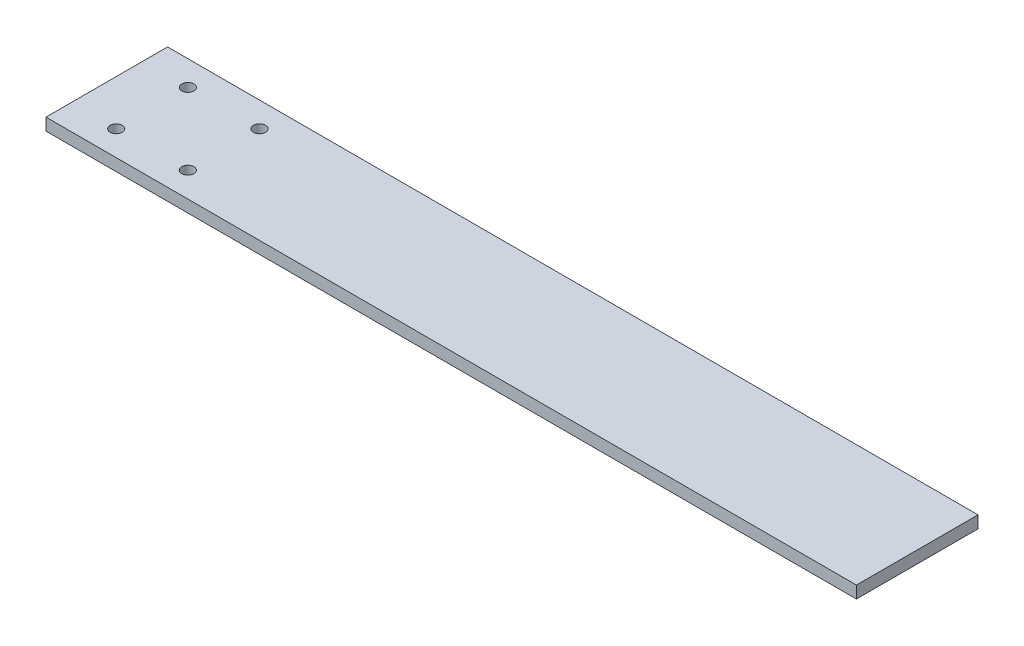
ISO-10303-21;
HEADER;
FILE_DESCRIPTION(('STEP AP214'),'2;1');
FILE_NAME('part.step','',(''),(''),'','','');
FILE_SCHEMA(('AUTOMOTIVE_DESIGN { 1 0 10303 214 1 1 1 1 }'));
ENDSEC;
DATA;
#1=APPLICATION_CONTEXT('core data for automotive mechanical design processes');
#2=APPLICATION_PROTOCOL_DEFINITION('international standard','automotive_design',2000,#1);
#3=PRODUCT_CONTEXT('',#1,'mechanical');
#4=PRODUCT('Part','Part','',(#3));
#5=PRODUCT_RELATED_PRODUCT_CATEGORY('part','',(#4));
#6=PRODUCT_DEFINITION_FORMATION('','',#4);
#7=PRODUCT_DEFINITION_CONTEXT('part definition',#1,'design');
#8=PRODUCT_DEFINITION('design','',#6,#7);
#9=PRODUCT_DEFINITION_SHAPE('','',#8);
#10=(LENGTH_UNIT() NAMED_UNIT(*) SI_UNIT(.MILLI.,.METRE.));
#11=(NAMED_UNIT(*) PLANE_ANGLE_UNIT() SI_UNIT($,.RADIAN.));
#12=(NAMED_UNIT(*) SI_UNIT($,.STERADIAN.) SOLID_ANGLE_UNIT());
#13=UNCERTAINTY_MEASURE_WITH_UNIT(LENGTH_MEASURE(1.E-05),#10,'distance_accuracy_value','');
#14=(GEOMETRIC_REPRESENTATION_CONTEXT(3) GLOBAL_UNCERTAINTY_ASSIGNED_CONTEXT((#13)) GLOBAL_UNIT_ASSIGNED_CONTEXT((#10,
#11,#12)) REPRESENTATION_CONTEXT('',''));
#15=CARTESIAN_POINT('',(0.,0.,0.));
#16=DIRECTION('',(0.,0.,1.));
#17=DIRECTION('',(1.,0.,0.));
#18=AXIS2_PLACEMENT_3D('',#15,#16,#17);
#19=CARTESIAN_POINT('',(0.,3.,0.));
#20=DIRECTION('',(0.,1.,0.));
#21=DIRECTION('',(0.,0.,1.));
#22=AXIS2_PLACEMENT_3D('',#19,#20,#21);
#23=PLANE('',#22);
#24=CARTESIAN_POINT('',(-71.1611652351681,3.,-8.83883476483182));
#25=DIRECTION('',(0.,1.,0.));
#26=DIRECTION('',(0.,0.,1.));
#27=AXIS2_PLACEMENT_3D('',#24,#25,#26);
#28=CIRCLE('',#27,1.49999999999999);
#29=CARTESIAN_POINT('',(-71.1611652351681,3.,-7.33883476483182));
#30=VERTEX_POINT('',#29);
#31=EDGE_CURVE('E121',#30,#30,#28,.T.);
#32=ORIENTED_EDGE('',*,*,#31,.F.);
#33=EDGE_LOOP('',(#32));
#34=FACE_BOUND('',#33,.T.);
#35=CARTESIAN_POINT('',(-88.8388347648318,3.,8.83883476483186));
#36=DIRECTION('',(0.,1.,0.));
#37=DIRECTION('',(0.,0.,1.));
#38=AXIS2_PLACEMENT_3D('',#35,#36,#37);
#39=CIRCLE('',#38,1.49999999999999);
#40=CARTESIAN_POINT('',(-88.8388347648318,3.,10.3388347648318));
#41=VERTEX_POINT('',#40);
#42=EDGE_CURVE('E100',#41,#41,#39,.T.);
#43=ORIENTED_EDGE('',*,*,#42,.F.);
#44=EDGE_LOOP('',(#43));
#45=FACE_BOUND('',#44,.T.);
#46=DIRECTION('',(0.,0.,-1.));
#47=VECTOR('',#46,1.);
#48=CARTESIAN_POINT('',(100.,3.,-15.));
#49=LINE('',#48,#47);
#50=CARTESIAN_POINT('',(100.,3.,15.));
#51=VERTEX_POINT('',#50);
#52=CARTESIAN_POINT('',(100.,3.,-15.));
#53=VERTEX_POINT('',#52);
#54=EDGE_CURVE('E85',#51,#53,#49,.T.);
#55=ORIENTED_EDGE('',*,*,#54,.T.);
#56=DIRECTION('',(-1.,0.,0.));
#57=VECTOR('',#56,1.);
#58=CARTESIAN_POINT('',(-100.,3.,-15.));
#59=LINE('',#58,#57);
#60=CARTESIAN_POINT('',(-100.,3.,-15.));
#61=VERTEX_POINT('',#60);
#62=EDGE_CURVE('E80',#53,#61,#59,.T.);
#63=ORIENTED_EDGE('',*,*,#62,.T.);
#64=DIRECTION('',(0.,0.,1.));
#65=VECTOR('',#64,1.);
#66=CARTESIAN_POINT('',(-100.,3.,-15.));
#67=LINE('',#66,#65);
#68=CARTESIAN_POINT('',(-100.,3.,15.));
#69=VERTEX_POINT('',#68);
#70=EDGE_CURVE('E83',#61,#69,#67,.T.);
#71=ORIENTED_EDGE('',*,*,#70,.T.);
#72=DIRECTION('',(1.,0.,0.));
#73=VECTOR('',#72,1.);
#74=CARTESIAN_POINT('',(-100.,3.,15.));
#75=LINE('',#74,#73);
#76=EDGE_CURVE('E50',#69,#51,#75,.T.);
#77=ORIENTED_EDGE('',*,*,#76,.T.);
#78=EDGE_LOOP('',(#55,#63,#71,#77));
#79=FACE_BOUND('',#78,.T.);
#80=CARTESIAN_POINT('',(-88.8388347648318,3.,-8.83883476483184));
#81=DIRECTION('',(0.,1.,0.));
#82=DIRECTION('',(0.,0.,1.));
#83=AXIS2_PLACEMENT_3D('',#80,#81,#82);
#84=CIRCLE('',#83,1.49999999999998);
#85=CARTESIAN_POINT('',(-88.8388347648318,3.,-7.33883476483185));
#86=VERTEX_POINT('',#85);
#87=EDGE_CURVE('E115',#86,#86,#84,.T.);
#88=ORIENTED_EDGE('',*,*,#87,.F.);
#89=EDGE_LOOP('',(#88));
#90=FACE_BOUND('',#89,.T.);
#91=CARTESIAN_POINT('',(-71.1611652351681,3.,8.83883476483183));
#92=DIRECTION('',(0.,1.,0.));
#93=DIRECTION('',(0.,0.,1.));
#94=AXIS2_PLACEMENT_3D('',#91,#92,#93);
#95=CIRCLE('',#94,1.49999999999993);
#96=CARTESIAN_POINT('',(-71.1611652351681,3.,10.3388347648318));
#97=VERTEX_POINT('',#96);
#98=EDGE_CURVE('E127',#97,#97,#95,.T.);
#99=ORIENTED_EDGE('',*,*,#98,.F.);
#100=EDGE_LOOP('',(#99));
#101=FACE_BOUND('',#100,.T.);
#102=ADVANCED_FACE('F33',(#34,#45,#79,#90,#101),#23,.T.);
#103=CARTESIAN_POINT('',(0.,0.,0.));
#104=DIRECTION('',(0.,1.,0.));
#105=DIRECTION('',(0.,0.,1.));
#106=AXIS2_PLACEMENT_3D('',#103,#104,#105);
#107=PLANE('',#106);
#108=DIRECTION('',(0.,0.,-1.));
#109=VECTOR('',#108,1.);
#110=CARTESIAN_POINT('',(100.,0.,-15.));
#111=LINE('',#110,#109);
#112=CARTESIAN_POINT('',(100.,0.,15.));
#113=VERTEX_POINT('',#112);
#114=CARTESIAN_POINT('',(100.,0.,-15.));
#115=VERTEX_POINT('',#114);
#116=EDGE_CURVE('E97',#113,#115,#111,.T.);
#117=ORIENTED_EDGE('',*,*,#116,.F.);
#118=DIRECTION('',(1.,0.,0.));
#119=VECTOR('',#118,1.);
#120=CARTESIAN_POINT('',(-100.,0.,15.));
#121=LINE('',#120,#119);
#122=CARTESIAN_POINT('',(-100.,0.,15.));
#123=VERTEX_POINT('',#122);
#124=EDGE_CURVE('E73',#123,#113,#121,.T.);
#125=ORIENTED_EDGE('',*,*,#124,.F.);
#126=DIRECTION('',(0.,0.,1.));
#127=VECTOR('',#126,1.);
#128=CARTESIAN_POINT('',(-100.,0.,-15.));
#129=LINE('',#128,#127);
#130=CARTESIAN_POINT('',(-100.,0.,-15.));
#131=VERTEX_POINT('',#130);
#132=EDGE_CURVE('E67',#131,#123,#129,.T.);
#133=ORIENTED_EDGE('',*,*,#132,.F.);
#134=DIRECTION('',(-1.,0.,0.));
#135=VECTOR('',#134,1.);
#136=CARTESIAN_POINT('',(-100.,0.,-15.));
#137=LINE('',#136,#135);
#138=EDGE_CURVE('E89',#115,#131,#137,.T.);
#139=ORIENTED_EDGE('',*,*,#138,.F.);
#140=EDGE_LOOP('',(#117,#125,#133,#139));
#141=FACE_BOUND('',#140,.T.);
#142=CARTESIAN_POINT('',(-88.8388347648318,0.,8.83883476483186));
#143=DIRECTION('',(0.,1.,0.));
#144=DIRECTION('',(0.,0.,1.));
#145=AXIS2_PLACEMENT_3D('',#142,#143,#144);
#146=CIRCLE('',#145,1.49999999999999);
#147=CARTESIAN_POINT('',(-88.8388347648318,0.,10.3388347648318));
#148=VERTEX_POINT('',#147);
#149=EDGE_CURVE('E112',#148,#148,#146,.T.);
#150=ORIENTED_EDGE('',*,*,#149,.T.);
#151=EDGE_LOOP('',(#150));
#152=FACE_BOUND('',#151,.T.);
#153=CARTESIAN_POINT('',(-88.8388347648318,0.,-8.83883476483184));
#154=DIRECTION('',(0.,1.,0.));
#155=DIRECTION('',(0.,0.,1.));
#156=AXIS2_PLACEMENT_3D('',#153,#154,#155);
#157=CIRCLE('',#156,1.49999999999998);
#158=CARTESIAN_POINT('',(-88.8388347648318,0.,-7.33883476483185));
#159=VERTEX_POINT('',#158);
#160=EDGE_CURVE('E118',#159,#159,#157,.T.);
#161=ORIENTED_EDGE('',*,*,#160,.T.);
#162=EDGE_LOOP('',(#161));
#163=FACE_BOUND('',#162,.T.);
#164=CARTESIAN_POINT('',(-71.1611652351681,0.,-8.83883476483182));
#165=DIRECTION('',(0.,1.,0.));
#166=DIRECTION('',(0.,0.,1.));
#167=AXIS2_PLACEMENT_3D('',#164,#165,#166);
#168=CIRCLE('',#167,1.49999999999999);
#169=CARTESIAN_POINT('',(-71.1611652351681,0.,-7.33883476483182));
#170=VERTEX_POINT('',#169);
#171=EDGE_CURVE('E124',#170,#170,#168,.T.);
#172=ORIENTED_EDGE('',*,*,#171,.T.);
#173=EDGE_LOOP('',(#172));
#174=FACE_BOUND('',#173,.T.);
#175=CARTESIAN_POINT('',(-71.1611652351681,0.,8.83883476483183));
#176=DIRECTION('',(0.,1.,0.));
#177=DIRECTION('',(0.,0.,1.));
#178=AXIS2_PLACEMENT_3D('',#175,#176,#177);
#179=CIRCLE('',#178,1.49999999999993);
#180=CARTESIAN_POINT('',(-71.1611652351681,0.,10.3388347648318));
#181=VERTEX_POINT('',#180);
#182=EDGE_CURVE('E130',#181,#181,#179,.T.);
#183=ORIENTED_EDGE('',*,*,#182,.T.);
#184=EDGE_LOOP('',(#183));
#185=FACE_BOUND('',#184,.T.);
#186=ADVANCED_FACE('F108',(#141,#152,#163,#174,#185),#107,.F.);
#187=CARTESIAN_POINT('',(100.,3.,-15.));
#188=DIRECTION('',(-1.,0.,0.));
#189=DIRECTION('',(0.,0.,1.));
#190=AXIS2_PLACEMENT_3D('',#187,#188,#189);
#191=PLANE('',#190);
#192=ORIENTED_EDGE('',*,*,#116,.T.);
#193=DIRECTION('',(0.,-1.,0.));
#194=VECTOR('',#193,1.);
#195=CARTESIAN_POINT('',(100.,3.,-15.));
#196=LINE('',#195,#194);
#197=EDGE_CURVE('E11',#53,#115,#196,.T.);
#198=ORIENTED_EDGE('',*,*,#197,.F.);
#199=ORIENTED_EDGE('',*,*,#54,.F.);
#200=DIRECTION('',(0.,-1.,0.));
#201=VECTOR('',#200,1.);
#202=CARTESIAN_POINT('',(100.,3.,15.));
#203=LINE('',#202,#201);
#204=EDGE_CURVE('E93',#51,#113,#203,.T.);
#205=ORIENTED_EDGE('',*,*,#204,.T.);
#206=EDGE_LOOP('',(#192,#198,#199,#205));
#207=FACE_BOUND('',#206,.T.);
#208=ADVANCED_FACE('F35',(#207),#191,.F.);
#209=CARTESIAN_POINT('',(-100.,3.,-15.));
#210=DIRECTION('',(0.,0.,1.));
#211=DIRECTION('',(1.,0.,0.));
#212=AXIS2_PLACEMENT_3D('',#209,#210,#211);
#213=PLANE('',#212);
#214=ORIENTED_EDGE('',*,*,#138,.T.);
#215=DIRECTION('',(0.,-1.,0.));
#216=VECTOR('',#215,1.);
#217=CARTESIAN_POINT('',(-100.,3.,-15.));
#218=LINE('',#217,#216);
#219=EDGE_CURVE('E42',#61,#131,#218,.T.);
#220=ORIENTED_EDGE('',*,*,#219,.F.);
#221=ORIENTED_EDGE('',*,*,#62,.F.);
#222=ORIENTED_EDGE('',*,*,#197,.T.);
#223=EDGE_LOOP('',(#214,#220,#221,#222));
#224=FACE_BOUND('',#223,.T.);
#225=ADVANCED_FACE('F88',(#224),#213,.F.);
#226=CARTESIAN_POINT('',(-100.,3.,-15.));
#227=DIRECTION('',(1.,0.,0.));
#228=DIRECTION('',(0.,0.,-1.));
#229=AXIS2_PLACEMENT_3D('',#226,#227,#228);
#230=PLANE('',#229);
#231=ORIENTED_EDGE('',*,*,#132,.T.);
#232=DIRECTION('',(0.,-1.,0.));
#233=VECTOR('',#232,1.);
#234=CARTESIAN_POINT('',(-100.,3.,15.));
#235=LINE('',#234,#233);
#236=EDGE_CURVE('E90',#69,#123,#235,.T.);
#237=ORIENTED_EDGE('',*,*,#236,.F.);
#238=ORIENTED_EDGE('',*,*,#70,.F.);
#239=ORIENTED_EDGE('',*,*,#219,.T.);
#240=EDGE_LOOP('',(#231,#237,#238,#239));
#241=FACE_BOUND('',#240,.T.);
#242=ADVANCED_FACE('F91',(#241),#230,.F.);
#243=CARTESIAN_POINT('',(-100.,3.,15.));
#244=DIRECTION('',(0.,0.,-1.));
#245=DIRECTION('',(-1.,0.,0.));
#246=AXIS2_PLACEMENT_3D('',#243,#244,#245);
#247=PLANE('',#246);
#248=ORIENTED_EDGE('',*,*,#124,.T.);
#249=ORIENTED_EDGE('',*,*,#204,.F.);
#250=ORIENTED_EDGE('',*,*,#76,.F.);
#251=ORIENTED_EDGE('',*,*,#236,.T.);
#252=EDGE_LOOP('',(#248,#249,#250,#251));
#253=FACE_BOUND('',#252,.T.);
#254=ADVANCED_FACE('F105',(#253),#247,.F.);
#255=CARTESIAN_POINT('',(-88.8388347648318,3.,8.83883476483186));
#256=DIRECTION('',(0.,-1.,0.));
#257=DIRECTION('',(0.,0.,-1.));
#258=AXIS2_PLACEMENT_3D('',#255,#256,#257);
#259=CYLINDRICAL_SURFACE('',#258,1.49999999999999);
#260=ORIENTED_EDGE('',*,*,#42,.T.);
#261=EDGE_LOOP('',(#260));
#262=FACE_BOUND('',#261,.T.);
#263=ORIENTED_EDGE('',*,*,#149,.F.);
#264=EDGE_LOOP('',(#263));
#265=FACE_BOUND('',#264,.T.);
#266=ADVANCED_FACE('F149',(#262,#265),#259,.F.);
#267=CARTESIAN_POINT('',(-88.8388347648318,3.,-8.83883476483184));
#268=DIRECTION('',(0.,-1.,0.));
#269=DIRECTION('',(0.,0.,-1.));
#270=AXIS2_PLACEMENT_3D('',#267,#268,#269);
#271=CYLINDRICAL_SURFACE('',#270,1.49999999999998);
#272=ORIENTED_EDGE('',*,*,#87,.T.);
#273=EDGE_LOOP('',(#272));
#274=FACE_BOUND('',#273,.T.);
#275=ORIENTED_EDGE('',*,*,#160,.F.);
#276=EDGE_LOOP('',(#275));
#277=FACE_BOUND('',#276,.T.);
#278=ADVANCED_FACE('F195',(#274,#277),#271,.F.);
#279=CARTESIAN_POINT('',(-71.1611652351681,3.,-8.83883476483182));
#280=DIRECTION('',(0.,-1.,0.));
#281=DIRECTION('',(0.,0.,-1.));
#282=AXIS2_PLACEMENT_3D('',#279,#280,#281);
#283=CYLINDRICAL_SURFACE('',#282,1.49999999999999);
#284=ORIENTED_EDGE('',*,*,#31,.T.);
#285=EDGE_LOOP('',(#284));
#286=FACE_BOUND('',#285,.T.);
#287=ORIENTED_EDGE('',*,*,#171,.F.);
#288=EDGE_LOOP('',(#287));
#289=FACE_BOUND('',#288,.T.);
#290=ADVANCED_FACE('F203',(#286,#289),#283,.F.);
#291=CARTESIAN_POINT('',(-71.1611652351681,3.,8.83883476483183));
#292=DIRECTION('',(0.,-1.,0.));
#293=DIRECTION('',(0.,0.,-1.));
#294=AXIS2_PLACEMENT_3D('',#291,#292,#293);
#295=CYLINDRICAL_SURFACE('',#294,1.49999999999993);
#296=ORIENTED_EDGE('',*,*,#98,.T.);
#297=EDGE_LOOP('',(#296));
#298=FACE_BOUND('',#297,.T.);
#299=ORIENTED_EDGE('',*,*,#182,.F.);
#300=EDGE_LOOP('',(#299));
#301=FACE_BOUND('',#300,.T.);
#302=ADVANCED_FACE('F136',(#298,#301),#295,.F.);
#303=CLOSED_SHELL('',(#102,#186,#208,#225,#242,#254,#266,#278,#290,#302));
#304=MANIFOLD_SOLID_BREP('B2',#303);
#305=ADVANCED_BREP_SHAPE_REPRESENTATION('',(#18,#304),#14);
#306=SHAPE_DEFINITION_REPRESENTATION(#9,#305);
ENDSEC;
END-ISO-10303-21;
